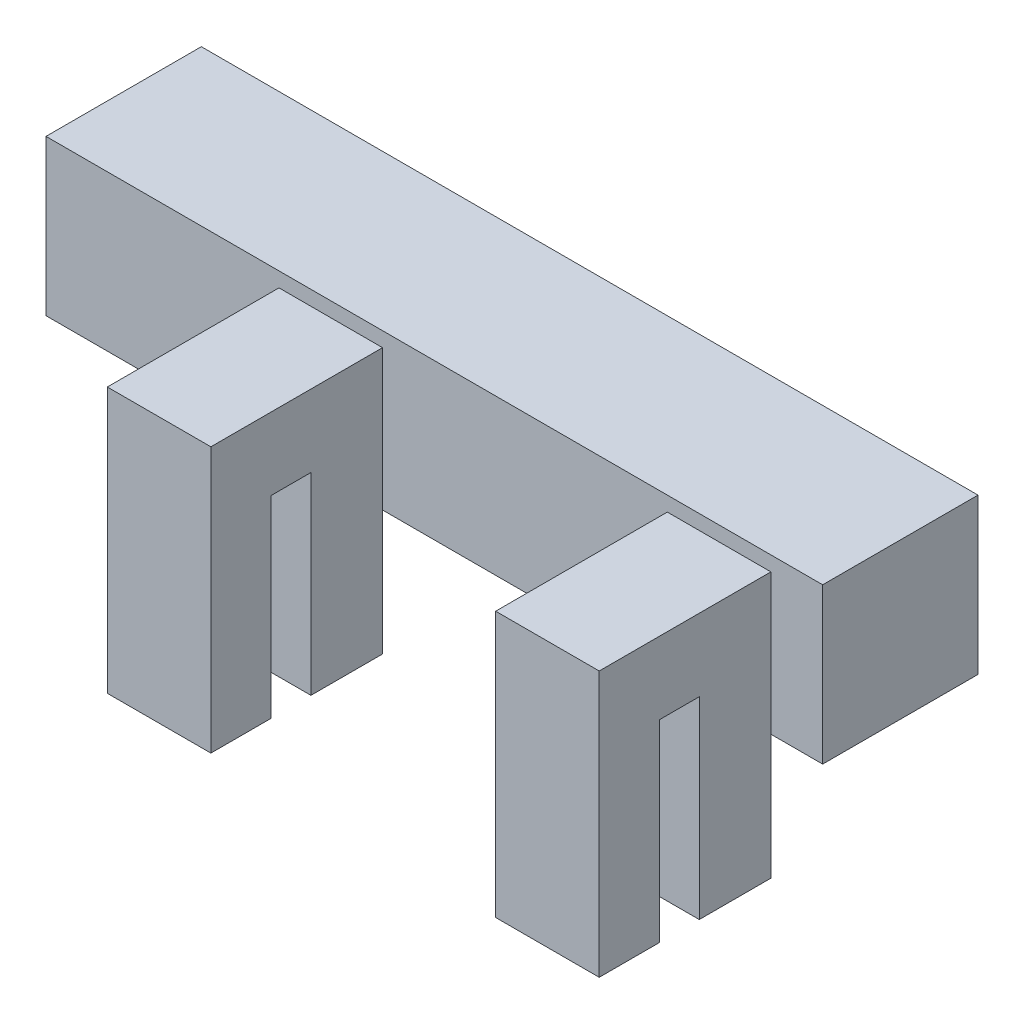
ISO-10303-21;
HEADER;
FILE_DESCRIPTION(('STEP AP214'),'2;1');
FILE_NAME('part.step','',(''),(''),'','','');
FILE_SCHEMA(('AUTOMOTIVE_DESIGN { 1 0 10303 214 1 1 1 1 }'));
ENDSEC;
DATA;
#1=APPLICATION_CONTEXT('core data for automotive mechanical design processes');
#2=APPLICATION_PROTOCOL_DEFINITION('international standard','automotive_design',2000,#1);
#3=PRODUCT_CONTEXT('',#1,'mechanical');
#4=PRODUCT('Part','Part','',(#3));
#5=PRODUCT_RELATED_PRODUCT_CATEGORY('part','',(#4));
#6=PRODUCT_DEFINITION_FORMATION('','',#4);
#7=PRODUCT_DEFINITION_CONTEXT('part definition',#1,'design');
#8=PRODUCT_DEFINITION('design','',#6,#7);
#9=PRODUCT_DEFINITION_SHAPE('','',#8);
#10=(LENGTH_UNIT() NAMED_UNIT(*) SI_UNIT(.MILLI.,.METRE.));
#11=(NAMED_UNIT(*) PLANE_ANGLE_UNIT() SI_UNIT($,.RADIAN.));
#12=(NAMED_UNIT(*) SI_UNIT($,.STERADIAN.) SOLID_ANGLE_UNIT());
#13=UNCERTAINTY_MEASURE_WITH_UNIT(LENGTH_MEASURE(1.E-05),#10,'distance_accuracy_value','');
#14=(GEOMETRIC_REPRESENTATION_CONTEXT(3) GLOBAL_UNCERTAINTY_ASSIGNED_CONTEXT((#13)) GLOBAL_UNIT_ASSIGNED_CONTEXT((#10,
#11,#12)) REPRESENTATION_CONTEXT('',''));
#15=CARTESIAN_POINT('',(0.,0.,0.));
#16=DIRECTION('',(0.,0.,1.));
#17=DIRECTION('',(1.,0.,0.));
#18=AXIS2_PLACEMENT_3D('',#15,#16,#17);
#19=CARTESIAN_POINT('',(0.,0.,30.));
#20=DIRECTION('',(0.,0.,1.));
#21=DIRECTION('',(1.,0.,0.));
#22=AXIS2_PLACEMENT_3D('',#19,#20,#21);
#23=PLANE('',#22);
#24=DIRECTION('',(-1.,0.,0.));
#25=VECTOR('',#24,1.);
#26=CARTESIAN_POINT('',(-10.,27.1581703390217,30.));
#27=LINE('',#26,#25);
#28=CARTESIAN_POINT('',(-10.,27.1581703390217,30.));
#29=VERTEX_POINT('',#28);
#30=CARTESIAN_POINT('',(-30.,27.1581703390217,30.));
#31=VERTEX_POINT('',#30);
#32=EDGE_CURVE('E48',#29,#31,#27,.T.);
#33=ORIENTED_EDGE('',*,*,#32,.F.);
#34=DIRECTION('',(0.,-1.,0.));
#35=VECTOR('',#34,1.);
#36=CARTESIAN_POINT('',(-10.,27.1581703390217,30.));
#37=LINE('',#36,#35);
#38=CARTESIAN_POINT('',(-10.,0.,30.));
#39=VERTEX_POINT('',#38);
#40=EDGE_CURVE('E191',#29,#39,#37,.T.);
#41=ORIENTED_EDGE('',*,*,#40,.T.);
#42=DIRECTION('',(1.,0.,0.));
#43=VECTOR('',#42,1.);
#44=CARTESIAN_POINT('',(0.,0.,30.));
#45=LINE('',#44,#43);
#46=CARTESIAN_POINT('',(0.,0.,30.));
#47=VERTEX_POINT('',#46);
#48=EDGE_CURVE('E333',#39,#47,#45,.T.);
#49=ORIENTED_EDGE('',*,*,#48,.T.);
#50=DIRECTION('',(0.,1.,0.));
#51=VECTOR('',#50,1.);
#52=CARTESIAN_POINT('',(0.,0.,30.));
#53=LINE('',#52,#51);
#54=CARTESIAN_POINT('',(0.,30.,30.));
#55=VERTEX_POINT('',#54);
#56=EDGE_CURVE('E325',#47,#55,#53,.T.);
#57=ORIENTED_EDGE('',*,*,#56,.T.);
#58=DIRECTION('',(-1.,0.,0.));
#59=VECTOR('',#58,1.);
#60=CARTESIAN_POINT('',(0.,30.,30.));
#61=LINE('',#60,#59);
#62=CARTESIAN_POINT('',(-150.,30.,30.));
#63=VERTEX_POINT('',#62);
#64=EDGE_CURVE('E328',#55,#63,#61,.T.);
#65=ORIENTED_EDGE('',*,*,#64,.T.);
#66=DIRECTION('',(0.,-1.,0.));
#67=VECTOR('',#66,1.);
#68=CARTESIAN_POINT('',(-150.,0.,30.));
#69=LINE('',#68,#67);
#70=CARTESIAN_POINT('',(-150.,0.,30.));
#71=VERTEX_POINT('',#70);
#72=EDGE_CURVE('E331',#63,#71,#69,.T.);
#73=ORIENTED_EDGE('',*,*,#72,.T.);
#74=CARTESIAN_POINT('',(-105.,0.,30.));
#75=VERTEX_POINT('',#74);
#76=EDGE_CURVE('E334',#71,#75,#45,.T.);
#77=ORIENTED_EDGE('',*,*,#76,.T.);
#78=DIRECTION('',(0.,-1.,0.));
#79=VECTOR('',#78,1.);
#80=CARTESIAN_POINT('',(-105.,27.1581703390217,30.));
#81=LINE('',#80,#79);
#82=CARTESIAN_POINT('',(-105.,27.1581703390217,30.));
#83=VERTEX_POINT('',#82);
#84=EDGE_CURVE('E284',#83,#75,#81,.T.);
#85=ORIENTED_EDGE('',*,*,#84,.F.);
#86=DIRECTION('',(-1.,0.,0.));
#87=VECTOR('',#86,1.);
#88=CARTESIAN_POINT('',(-85.,27.1581703390217,30.));
#89=LINE('',#88,#87);
#90=CARTESIAN_POINT('',(-85.,27.1581703390217,30.));
#91=VERTEX_POINT('',#90);
#92=EDGE_CURVE('E308',#91,#83,#89,.T.);
#93=ORIENTED_EDGE('',*,*,#92,.F.);
#94=DIRECTION('',(0.,-1.,0.));
#95=VECTOR('',#94,1.);
#96=CARTESIAN_POINT('',(-85.,27.1581703390217,30.));
#97=LINE('',#96,#95);
#98=CARTESIAN_POINT('',(-85.,0.,30.));
#99=VERTEX_POINT('',#98);
#100=EDGE_CURVE('E258',#91,#99,#97,.T.);
#101=ORIENTED_EDGE('',*,*,#100,.T.);
#102=CARTESIAN_POINT('',(-30.,0.,30.));
#103=VERTEX_POINT('',#102);
#104=EDGE_CURVE('E370',#99,#103,#45,.T.);
#105=ORIENTED_EDGE('',*,*,#104,.T.);
#106=DIRECTION('',(0.,-1.,0.));
#107=VECTOR('',#106,1.);
#108=CARTESIAN_POINT('',(-30.,27.1581703390217,30.));
#109=LINE('',#108,#107);
#110=EDGE_CURVE('E53',#31,#103,#109,.T.);
#111=ORIENTED_EDGE('',*,*,#110,.F.);
#112=EDGE_LOOP('',(#33,#41,#49,#57,#65,#73,#77,#85,#93,#101,#105,#111));
#113=FACE_BOUND('',#112,.T.);
#114=ADVANCED_FACE('F33',(#113),#23,.T.);
#115=CARTESIAN_POINT('',(0.,0.,30.));
#116=DIRECTION('',(-1.,0.,0.));
#117=DIRECTION('',(0.,-1.,0.));
#118=AXIS2_PLACEMENT_3D('',#115,#116,#117);
#119=PLANE('',#118);
#120=DIRECTION('',(0.,1.,0.));
#121=VECTOR('',#120,1.);
#122=CARTESIAN_POINT('',(0.,0.,0.));
#123=LINE('',#122,#121);
#124=CARTESIAN_POINT('',(0.,0.,0.));
#125=VERTEX_POINT('',#124);
#126=CARTESIAN_POINT('',(0.,30.,0.));
#127=VERTEX_POINT('',#126);
#128=EDGE_CURVE('E310',#125,#127,#123,.T.);
#129=ORIENTED_EDGE('',*,*,#128,.T.);
#130=DIRECTION('',(0.,0.,-1.));
#131=VECTOR('',#130,1.);
#132=CARTESIAN_POINT('',(0.,30.,30.));
#133=LINE('',#132,#131);
#134=EDGE_CURVE('E11',#55,#127,#133,.T.);
#135=ORIENTED_EDGE('',*,*,#134,.F.);
#136=ORIENTED_EDGE('',*,*,#56,.F.);
#137=DIRECTION('',(0.,0.,-1.));
#138=VECTOR('',#137,1.);
#139=CARTESIAN_POINT('',(0.,0.,30.));
#140=LINE('',#139,#138);
#141=EDGE_CURVE('E337',#47,#125,#140,.T.);
#142=ORIENTED_EDGE('',*,*,#141,.T.);
#143=EDGE_LOOP('',(#129,#135,#136,#142));
#144=FACE_BOUND('',#143,.T.);
#145=ADVANCED_FACE('F35',(#144),#119,.F.);
#146=CARTESIAN_POINT('',(0.,30.,30.));
#147=DIRECTION('',(0.,-1.,0.));
#148=DIRECTION('',(1.,0.,0.));
#149=AXIS2_PLACEMENT_3D('',#146,#147,#148);
#150=PLANE('',#149);
#151=DIRECTION('',(-1.,0.,0.));
#152=VECTOR('',#151,1.);
#153=CARTESIAN_POINT('',(0.,30.,0.));
#154=LINE('',#153,#152);
#155=CARTESIAN_POINT('',(-150.,30.,0.));
#156=VERTEX_POINT('',#155);
#157=EDGE_CURVE('E341',#127,#156,#154,.T.);
#158=ORIENTED_EDGE('',*,*,#157,.T.);
#159=DIRECTION('',(0.,0.,-1.));
#160=VECTOR('',#159,1.);
#161=CARTESIAN_POINT('',(-150.,30.,30.));
#162=LINE('',#161,#160);
#163=EDGE_CURVE('E41',#63,#156,#162,.T.);
#164=ORIENTED_EDGE('',*,*,#163,.F.);
#165=ORIENTED_EDGE('',*,*,#64,.F.);
#166=ORIENTED_EDGE('',*,*,#134,.T.);
#167=EDGE_LOOP('',(#158,#164,#165,#166));
#168=FACE_BOUND('',#167,.T.);
#169=ADVANCED_FACE('F417',(#168),#150,.F.);
#170=CARTESIAN_POINT('',(-150.,0.,30.));
#171=DIRECTION('',(1.,0.,0.));
#172=DIRECTION('',(0.,0.,-1.));
#173=AXIS2_PLACEMENT_3D('',#170,#171,#172);
#174=PLANE('',#173);
#175=DIRECTION('',(0.,-1.,0.));
#176=VECTOR('',#175,1.);
#177=CARTESIAN_POINT('',(-150.,0.,0.));
#178=LINE('',#177,#176);
#179=CARTESIAN_POINT('',(-150.,0.,0.));
#180=VERTEX_POINT('',#179);
#181=EDGE_CURVE('E343',#156,#180,#178,.T.);
#182=ORIENTED_EDGE('',*,*,#181,.T.);
#183=DIRECTION('',(0.,0.,-1.));
#184=VECTOR('',#183,1.);
#185=CARTESIAN_POINT('',(-150.,0.,30.));
#186=LINE('',#185,#184);
#187=EDGE_CURVE('E348',#71,#180,#186,.T.);
#188=ORIENTED_EDGE('',*,*,#187,.F.);
#189=ORIENTED_EDGE('',*,*,#72,.F.);
#190=ORIENTED_EDGE('',*,*,#163,.T.);
#191=EDGE_LOOP('',(#182,#188,#189,#190));
#192=FACE_BOUND('',#191,.T.);
#193=ADVANCED_FACE('F355',(#192),#174,.F.);
#194=CARTESIAN_POINT('',(0.,0.,30.));
#195=DIRECTION('',(0.,1.,0.));
#196=DIRECTION('',(-1.,0.,0.));
#197=AXIS2_PLACEMENT_3D('',#194,#195,#196);
#198=PLANE('',#197);
#199=DIRECTION('',(1.,0.,0.));
#200=VECTOR('',#199,1.);
#201=CARTESIAN_POINT('',(0.,0.,0.));
#202=LINE('',#201,#200);
#203=EDGE_CURVE('E329',#180,#125,#202,.T.);
#204=ORIENTED_EDGE('',*,*,#203,.T.);
#205=ORIENTED_EDGE('',*,*,#141,.F.);
#206=ORIENTED_EDGE('',*,*,#48,.F.);
#207=EDGE_CURVE('E188',#103,#39,#45,.T.);
#208=ORIENTED_EDGE('',*,*,#207,.F.);
#209=ORIENTED_EDGE('',*,*,#104,.F.);
#210=EDGE_CURVE('E338',#75,#99,#45,.T.);
#211=ORIENTED_EDGE('',*,*,#210,.F.);
#212=ORIENTED_EDGE('',*,*,#76,.F.);
#213=ORIENTED_EDGE('',*,*,#187,.T.);
#214=EDGE_LOOP('',(#204,#205,#206,#208,#209,#211,#212,#213));
#215=FACE_BOUND('',#214,.T.);
#216=ADVANCED_FACE('F364',(#215),#198,.F.);
#217=CARTESIAN_POINT('',(0.,0.,0.));
#218=DIRECTION('',(0.,0.,1.));
#219=DIRECTION('',(1.,0.,0.));
#220=AXIS2_PLACEMENT_3D('',#217,#218,#219);
#221=PLANE('',#220);
#222=ORIENTED_EDGE('',*,*,#128,.F.);
#223=ORIENTED_EDGE('',*,*,#203,.F.);
#224=ORIENTED_EDGE('',*,*,#181,.F.);
#225=ORIENTED_EDGE('',*,*,#157,.F.);
#226=EDGE_LOOP('',(#222,#223,#224,#225));
#227=FACE_BOUND('',#226,.T.);
#228=ADVANCED_FACE('F361',(#227),#221,.F.);
#229=CARTESIAN_POINT('',(-85.,27.1581703390217,30.));
#230=DIRECTION('',(0.,0.,-1.));
#231=DIRECTION('',(-1.,0.,0.));
#232=AXIS2_PLACEMENT_3D('',#229,#230,#231);
#233=PLANE('',#232);
#234=CARTESIAN_POINT('',(-105.,-24.0798332325672,30.));
#235=VERTEX_POINT('',#234);
#236=EDGE_CURVE('E246',#75,#235,#81,.T.);
#237=ORIENTED_EDGE('',*,*,#236,.F.);
#238=ORIENTED_EDGE('',*,*,#210,.T.);
#239=CARTESIAN_POINT('',(-85.,-24.0798332325672,30.));
#240=VERTEX_POINT('',#239);
#241=EDGE_CURVE('E262',#99,#240,#97,.T.);
#242=ORIENTED_EDGE('',*,*,#241,.T.);
#243=DIRECTION('',(-1.,0.,0.));
#244=VECTOR('',#243,1.);
#245=CARTESIAN_POINT('',(-85.,-24.0798332325672,30.));
#246=LINE('',#245,#244);
#247=EDGE_CURVE('E283',#240,#235,#246,.T.);
#248=ORIENTED_EDGE('',*,*,#247,.T.);
#249=EDGE_LOOP('',(#237,#238,#242,#248));
#250=FACE_BOUND('',#249,.T.);
#251=ADVANCED_FACE('F375',(#250),#233,.T.);
#252=CARTESIAN_POINT('',(-85.,27.1581703390217,30.));
#253=DIRECTION('',(0.,1.,0.));
#254=DIRECTION('',(0.,0.,1.));
#255=AXIS2_PLACEMENT_3D('',#252,#253,#254);
#256=PLANE('',#255);
#257=DIRECTION('',(0.,0.,-1.));
#258=VECTOR('',#257,1.);
#259=CARTESIAN_POINT('',(-105.,27.1581703390217,30.));
#260=LINE('',#259,#258);
#261=CARTESIAN_POINT('',(-105.,27.1581703390217,63.1561933360463));
#262=VERTEX_POINT('',#261);
#263=EDGE_CURVE('E305',#262,#83,#260,.T.);
#264=ORIENTED_EDGE('',*,*,#263,.F.);
#265=DIRECTION('',(-1.,0.,0.));
#266=VECTOR('',#265,1.);
#267=CARTESIAN_POINT('',(-85.,27.1581703390217,63.1561933360463));
#268=LINE('',#267,#266);
#269=CARTESIAN_POINT('',(-85.,27.1581703390217,63.1561933360463));
#270=VERTEX_POINT('',#269);
#271=EDGE_CURVE('E311',#270,#262,#268,.T.);
#272=ORIENTED_EDGE('',*,*,#271,.F.);
#273=DIRECTION('',(0.,0.,-1.));
#274=VECTOR('',#273,1.);
#275=CARTESIAN_POINT('',(-85.,27.1581703390217,30.));
#276=LINE('',#275,#274);
#277=EDGE_CURVE('E280',#270,#91,#276,.T.);
#278=ORIENTED_EDGE('',*,*,#277,.T.);
#279=ORIENTED_EDGE('',*,*,#92,.T.);
#280=EDGE_LOOP('',(#264,#272,#278,#279));
#281=FACE_BOUND('',#280,.T.);
#282=ADVANCED_FACE('F450',(#281),#256,.T.);
#283=CARTESIAN_POINT('',(-85.,27.1581703390217,63.1561933360463));
#284=DIRECTION('',(0.,0.,1.));
#285=DIRECTION('',(1.,0.,0.));
#286=AXIS2_PLACEMENT_3D('',#283,#284,#285);
#287=PLANE('',#286);
#288=DIRECTION('',(0.,1.,0.));
#289=VECTOR('',#288,1.);
#290=CARTESIAN_POINT('',(-105.,27.1581703390217,63.1561933360463));
#291=LINE('',#290,#289);
#292=CARTESIAN_POINT('',(-105.,-24.0798332325672,63.1561933360463));
#293=VERTEX_POINT('',#292);
#294=EDGE_CURVE('E302',#293,#262,#291,.T.);
#295=ORIENTED_EDGE('',*,*,#294,.F.);
#296=DIRECTION('',(-1.,0.,0.));
#297=VECTOR('',#296,1.);
#298=CARTESIAN_POINT('',(-85.,-24.0798332325672,63.1561933360463));
#299=LINE('',#298,#297);
#300=CARTESIAN_POINT('',(-85.,-24.0798332325672,63.1561933360463));
#301=VERTEX_POINT('',#300);
#302=EDGE_CURVE('E313',#301,#293,#299,.T.);
#303=ORIENTED_EDGE('',*,*,#302,.F.);
#304=DIRECTION('',(0.,1.,0.));
#305=VECTOR('',#304,1.);
#306=CARTESIAN_POINT('',(-85.,27.1581703390217,63.1561933360463));
#307=LINE('',#306,#305);
#308=EDGE_CURVE('E277',#301,#270,#307,.T.);
#309=ORIENTED_EDGE('',*,*,#308,.T.);
#310=ORIENTED_EDGE('',*,*,#271,.T.);
#311=EDGE_LOOP('',(#295,#303,#309,#310));
#312=FACE_BOUND('',#311,.T.);
#313=ADVANCED_FACE('F456',(#312),#287,.T.);
#314=CARTESIAN_POINT('',(-85.,-24.0798332325672,51.5046134278178));
#315=DIRECTION('',(0.,-1.,0.));
#316=DIRECTION('',(0.,0.,-1.));
#317=AXIS2_PLACEMENT_3D('',#314,#315,#316);
#318=PLANE('',#317);
#319=DIRECTION('',(0.,0.,1.));
#320=VECTOR('',#319,1.);
#321=CARTESIAN_POINT('',(-105.,-24.0798332325672,51.5046134278178));
#322=LINE('',#321,#320);
#323=CARTESIAN_POINT('',(-105.,-24.0798332325672,51.5046134278178));
#324=VERTEX_POINT('',#323);
#325=EDGE_CURVE('E299',#324,#293,#322,.T.);
#326=ORIENTED_EDGE('',*,*,#325,.F.);
#327=DIRECTION('',(-1.,0.,0.));
#328=VECTOR('',#327,1.);
#329=CARTESIAN_POINT('',(-85.,-24.0798332325672,51.5046134278178));
#330=LINE('',#329,#328);
#331=CARTESIAN_POINT('',(-85.,-24.0798332325672,51.5046134278178));
#332=VERTEX_POINT('',#331);
#333=EDGE_CURVE('E315',#332,#324,#330,.T.);
#334=ORIENTED_EDGE('',*,*,#333,.F.);
#335=DIRECTION('',(0.,0.,1.));
#336=VECTOR('',#335,1.);
#337=CARTESIAN_POINT('',(-85.,-24.0798332325672,51.5046134278178));
#338=LINE('',#337,#336);
#339=EDGE_CURVE('E274',#332,#301,#338,.T.);
#340=ORIENTED_EDGE('',*,*,#339,.T.);
#341=ORIENTED_EDGE('',*,*,#302,.T.);
#342=EDGE_LOOP('',(#326,#334,#340,#341));
#343=FACE_BOUND('',#342,.T.);
#344=ADVANCED_FACE('F464',(#343),#318,.T.);
#345=CARTESIAN_POINT('',(-85.,-24.0798332325672,51.5046134278178));
#346=DIRECTION('',(0.,0.,-1.));
#347=DIRECTION('',(-1.,0.,0.));
#348=AXIS2_PLACEMENT_3D('',#345,#346,#347);
#349=PLANE('',#348);
#350=DIRECTION('',(0.,-1.,0.));
#351=VECTOR('',#350,1.);
#352=CARTESIAN_POINT('',(-105.,-24.0798332325672,51.5046134278178));
#353=LINE('',#352,#351);
#354=CARTESIAN_POINT('',(-105.,13.1907484614558,51.5046134278178));
#355=VERTEX_POINT('',#354);
#356=EDGE_CURVE('E296',#355,#324,#353,.T.);
#357=ORIENTED_EDGE('',*,*,#356,.F.);
#358=DIRECTION('',(-1.,0.,0.));
#359=VECTOR('',#358,1.);
#360=CARTESIAN_POINT('',(-85.,13.1907484614558,51.5046134278178));
#361=LINE('',#360,#359);
#362=CARTESIAN_POINT('',(-85.,13.1907484614558,51.5046134278178));
#363=VERTEX_POINT('',#362);
#364=EDGE_CURVE('E317',#363,#355,#361,.T.);
#365=ORIENTED_EDGE('',*,*,#364,.F.);
#366=DIRECTION('',(0.,-1.,0.));
#367=VECTOR('',#366,1.);
#368=CARTESIAN_POINT('',(-85.,-24.0798332325672,51.5046134278178));
#369=LINE('',#368,#367);
#370=EDGE_CURVE('E271',#363,#332,#369,.T.);
#371=ORIENTED_EDGE('',*,*,#370,.T.);
#372=ORIENTED_EDGE('',*,*,#333,.T.);
#373=EDGE_LOOP('',(#357,#365,#371,#372));
#374=FACE_BOUND('',#373,.T.);
#375=ADVANCED_FACE('F472',(#374),#349,.T.);
#376=CARTESIAN_POINT('',(-85.,13.1907484614558,43.8333869043878));
#377=DIRECTION('',(0.,-1.,0.));
#378=DIRECTION('',(0.,0.,-1.));
#379=AXIS2_PLACEMENT_3D('',#376,#377,#378);
#380=PLANE('',#379);
#381=DIRECTION('',(0.,0.,1.));
#382=VECTOR('',#381,1.);
#383=CARTESIAN_POINT('',(-105.,13.1907484614558,43.8333869043878));
#384=LINE('',#383,#382);
#385=CARTESIAN_POINT('',(-105.,13.1907484614558,43.8333869043878));
#386=VERTEX_POINT('',#385);
#387=EDGE_CURVE('E293',#386,#355,#384,.T.);
#388=ORIENTED_EDGE('',*,*,#387,.F.);
#389=DIRECTION('',(-1.,0.,0.));
#390=VECTOR('',#389,1.);
#391=CARTESIAN_POINT('',(-85.,13.1907484614558,43.8333869043878));
#392=LINE('',#391,#390);
#393=CARTESIAN_POINT('',(-85.,13.1907484614558,43.8333869043878));
#394=VERTEX_POINT('',#393);
#395=EDGE_CURVE('E319',#394,#386,#392,.T.);
#396=ORIENTED_EDGE('',*,*,#395,.F.);
#397=DIRECTION('',(0.,0.,1.));
#398=VECTOR('',#397,1.);
#399=CARTESIAN_POINT('',(-85.,13.1907484614558,43.8333869043878));
#400=LINE('',#399,#398);
#401=EDGE_CURVE('E268',#394,#363,#400,.T.);
#402=ORIENTED_EDGE('',*,*,#401,.T.);
#403=ORIENTED_EDGE('',*,*,#364,.T.);
#404=EDGE_LOOP('',(#388,#396,#402,#403));
#405=FACE_BOUND('',#404,.T.);
#406=ADVANCED_FACE('F480',(#405),#380,.T.);
#407=CARTESIAN_POINT('',(-85.,-24.0798332325672,43.8333869043878));
#408=DIRECTION('',(0.,0.,1.));
#409=DIRECTION('',(1.,0.,0.));
#410=AXIS2_PLACEMENT_3D('',#407,#408,#409);
#411=PLANE('',#410);
#412=DIRECTION('',(0.,1.,0.));
#413=VECTOR('',#412,1.);
#414=CARTESIAN_POINT('',(-105.,-24.0798332325672,43.8333869043878));
#415=LINE('',#414,#413);
#416=CARTESIAN_POINT('',(-105.,-24.0798332325672,43.8333869043878));
#417=VERTEX_POINT('',#416);
#418=EDGE_CURVE('E290',#417,#386,#415,.T.);
#419=ORIENTED_EDGE('',*,*,#418,.F.);
#420=DIRECTION('',(-1.,0.,0.));
#421=VECTOR('',#420,1.);
#422=CARTESIAN_POINT('',(-85.,-24.0798332325672,43.8333869043878));
#423=LINE('',#422,#421);
#424=CARTESIAN_POINT('',(-85.,-24.0798332325672,43.8333869043878));
#425=VERTEX_POINT('',#424);
#426=EDGE_CURVE('E321',#425,#417,#423,.T.);
#427=ORIENTED_EDGE('',*,*,#426,.F.);
#428=DIRECTION('',(0.,1.,0.));
#429=VECTOR('',#428,1.);
#430=CARTESIAN_POINT('',(-85.,-24.0798332325672,43.8333869043878));
#431=LINE('',#430,#429);
#432=EDGE_CURVE('E265',#425,#394,#431,.T.);
#433=ORIENTED_EDGE('',*,*,#432,.T.);
#434=ORIENTED_EDGE('',*,*,#395,.T.);
#435=EDGE_LOOP('',(#419,#427,#433,#434));
#436=FACE_BOUND('',#435,.T.);
#437=ADVANCED_FACE('F488',(#436),#411,.T.);
#438=CARTESIAN_POINT('',(-85.,-24.0798332325672,30.));
#439=DIRECTION('',(0.,-1.,0.));
#440=DIRECTION('',(0.,0.,-1.));
#441=AXIS2_PLACEMENT_3D('',#438,#439,#440);
#442=PLANE('',#441);
#443=DIRECTION('',(0.,0.,1.));
#444=VECTOR('',#443,1.);
#445=CARTESIAN_POINT('',(-105.,-24.0798332325672,30.));
#446=LINE('',#445,#444);
#447=EDGE_CURVE('E287',#235,#417,#446,.T.);
#448=ORIENTED_EDGE('',*,*,#447,.F.);
#449=ORIENTED_EDGE('',*,*,#247,.F.);
#450=DIRECTION('',(0.,0.,1.));
#451=VECTOR('',#450,1.);
#452=CARTESIAN_POINT('',(-85.,-24.0798332325672,30.));
#453=LINE('',#452,#451);
#454=EDGE_CURVE('E261',#240,#425,#453,.T.);
#455=ORIENTED_EDGE('',*,*,#454,.T.);
#456=ORIENTED_EDGE('',*,*,#426,.T.);
#457=EDGE_LOOP('',(#448,#449,#455,#456));
#458=FACE_BOUND('',#457,.T.);
#459=ADVANCED_FACE('F496',(#458),#442,.T.);
#460=CARTESIAN_POINT('',(-85.,0.,0.));
#461=DIRECTION('',(-1.,0.,0.));
#462=DIRECTION('',(0.,0.,1.));
#463=AXIS2_PLACEMENT_3D('',#460,#461,#462);
#464=PLANE('',#463);
#465=ORIENTED_EDGE('',*,*,#100,.F.);
#466=ORIENTED_EDGE('',*,*,#277,.F.);
#467=ORIENTED_EDGE('',*,*,#308,.F.);
#468=ORIENTED_EDGE('',*,*,#339,.F.);
#469=ORIENTED_EDGE('',*,*,#370,.F.);
#470=ORIENTED_EDGE('',*,*,#401,.F.);
#471=ORIENTED_EDGE('',*,*,#432,.F.);
#472=ORIENTED_EDGE('',*,*,#454,.F.);
#473=ORIENTED_EDGE('',*,*,#241,.F.);
#474=EDGE_LOOP('',(#465,#466,#467,#468,#469,#470,#471,#472,#473));
#475=FACE_BOUND('',#474,.T.);
#476=ADVANCED_FACE('F504',(#475),#464,.F.);
#477=CARTESIAN_POINT('',(-105.,0.,0.));
#478=DIRECTION('',(-1.,0.,0.));
#479=DIRECTION('',(0.,0.,1.));
#480=AXIS2_PLACEMENT_3D('',#477,#478,#479);
#481=PLANE('',#480);
#482=ORIENTED_EDGE('',*,*,#84,.T.);
#483=ORIENTED_EDGE('',*,*,#236,.T.);
#484=ORIENTED_EDGE('',*,*,#447,.T.);
#485=ORIENTED_EDGE('',*,*,#418,.T.);
#486=ORIENTED_EDGE('',*,*,#387,.T.);
#487=ORIENTED_EDGE('',*,*,#356,.T.);
#488=ORIENTED_EDGE('',*,*,#325,.T.);
#489=ORIENTED_EDGE('',*,*,#294,.T.);
#490=ORIENTED_EDGE('',*,*,#263,.T.);
#491=EDGE_LOOP('',(#482,#483,#484,#485,#486,#487,#488,#489,#490));
#492=FACE_BOUND('',#491,.T.);
#493=ADVANCED_FACE('F511',(#492),#481,.T.);
#494=CARTESIAN_POINT('',(-10.,27.1581703390217,30.));
#495=DIRECTION('',(0.,0.,-1.));
#496=DIRECTION('',(-1.,0.,0.));
#497=AXIS2_PLACEMENT_3D('',#494,#495,#496);
#498=PLANE('',#497);
#499=ORIENTED_EDGE('',*,*,#207,.T.);
#500=CARTESIAN_POINT('',(-10.,-24.0798332325672,30.));
#501=VERTEX_POINT('',#500);
#502=EDGE_CURVE('E181',#39,#501,#37,.T.);
#503=ORIENTED_EDGE('',*,*,#502,.T.);
#504=DIRECTION('',(-1.,0.,0.));
#505=VECTOR('',#504,1.);
#506=CARTESIAN_POINT('',(-10.,-24.0798332325672,30.));
#507=LINE('',#506,#505);
#508=CARTESIAN_POINT('',(-30.,-24.0798332325672,30.));
#509=VERTEX_POINT('',#508);
#510=EDGE_CURVE('E185',#501,#509,#507,.T.);
#511=ORIENTED_EDGE('',*,*,#510,.T.);
#512=EDGE_CURVE('E226',#103,#509,#109,.T.);
#513=ORIENTED_EDGE('',*,*,#512,.F.);
#514=EDGE_LOOP('',(#499,#503,#511,#513));
#515=FACE_BOUND('',#514,.T.);
#516=ADVANCED_FACE('F183',(#515),#498,.T.);
#517=CARTESIAN_POINT('',(-10.,27.1581703390217,30.));
#518=DIRECTION('',(0.,1.,0.));
#519=DIRECTION('',(0.,0.,1.));
#520=AXIS2_PLACEMENT_3D('',#517,#518,#519);
#521=PLANE('',#520);
#522=DIRECTION('',(0.,0.,-1.));
#523=VECTOR('',#522,1.);
#524=CARTESIAN_POINT('',(-30.,27.1581703390217,30.));
#525=LINE('',#524,#523);
#526=CARTESIAN_POINT('',(-30.,27.1581703390217,63.1561933360463));
#527=VERTEX_POINT('',#526);
#528=EDGE_CURVE('E192',#527,#31,#525,.T.);
#529=ORIENTED_EDGE('',*,*,#528,.F.);
#530=DIRECTION('',(-1.,0.,0.));
#531=VECTOR('',#530,1.);
#532=CARTESIAN_POINT('',(-10.,27.1581703390217,63.1561933360463));
#533=LINE('',#532,#531);
#534=CARTESIAN_POINT('',(-10.,27.1581703390217,63.1561933360463));
#535=VERTEX_POINT('',#534);
#536=EDGE_CURVE('E247',#535,#527,#533,.T.);
#537=ORIENTED_EDGE('',*,*,#536,.F.);
#538=DIRECTION('',(0.,0.,-1.));
#539=VECTOR('',#538,1.);
#540=CARTESIAN_POINT('',(-10.,27.1581703390217,30.));
#541=LINE('',#540,#539);
#542=EDGE_CURVE('E201',#535,#29,#541,.T.);
#543=ORIENTED_EDGE('',*,*,#542,.T.);
#544=ORIENTED_EDGE('',*,*,#32,.T.);
#545=EDGE_LOOP('',(#529,#537,#543,#544));
#546=FACE_BOUND('',#545,.T.);
#547=ADVANCED_FACE('F386',(#546),#521,.T.);
#548=CARTESIAN_POINT('',(-10.,27.1581703390217,63.1561933360463));
#549=DIRECTION('',(0.,0.,1.));
#550=DIRECTION('',(1.,0.,0.));
#551=AXIS2_PLACEMENT_3D('',#548,#549,#550);
#552=PLANE('',#551);
#553=DIRECTION('',(0.,1.,0.));
#554=VECTOR('',#553,1.);
#555=CARTESIAN_POINT('',(-30.,27.1581703390217,63.1561933360463));
#556=LINE('',#555,#554);
#557=CARTESIAN_POINT('',(-30.,-24.0798332325672,63.1561933360463));
#558=VERTEX_POINT('',#557);
#559=EDGE_CURVE('E240',#558,#527,#556,.T.);
#560=ORIENTED_EDGE('',*,*,#559,.F.);
#561=DIRECTION('',(-1.,0.,0.));
#562=VECTOR('',#561,1.);
#563=CARTESIAN_POINT('',(-10.,-24.0798332325672,63.1561933360463));
#564=LINE('',#563,#562);
#565=CARTESIAN_POINT('',(-10.,-24.0798332325672,63.1561933360463));
#566=VERTEX_POINT('',#565);
#567=EDGE_CURVE('E249',#566,#558,#564,.T.);
#568=ORIENTED_EDGE('',*,*,#567,.F.);
#569=DIRECTION('',(0.,1.,0.));
#570=VECTOR('',#569,1.);
#571=CARTESIAN_POINT('',(-10.,27.1581703390217,63.1561933360463));
#572=LINE('',#571,#570);
#573=EDGE_CURVE('E220',#566,#535,#572,.T.);
#574=ORIENTED_EDGE('',*,*,#573,.T.);
#575=ORIENTED_EDGE('',*,*,#536,.T.);
#576=EDGE_LOOP('',(#560,#568,#574,#575));
#577=FACE_BOUND('',#576,.T.);
#578=ADVANCED_FACE('F530',(#577),#552,.T.);
#579=CARTESIAN_POINT('',(-10.,-24.0798332325672,51.5046134278178));
#580=DIRECTION('',(0.,-1.,0.));
#581=DIRECTION('',(0.,0.,-1.));
#582=AXIS2_PLACEMENT_3D('',#579,#580,#581);
#583=PLANE('',#582);
#584=DIRECTION('',(0.,0.,1.));
#585=VECTOR('',#584,1.);
#586=CARTESIAN_POINT('',(-30.,-24.0798332325672,51.5046134278178));
#587=LINE('',#586,#585);
#588=CARTESIAN_POINT('',(-30.,-24.0798332325672,51.5046134278178));
#589=VERTEX_POINT('',#588);
#590=EDGE_CURVE('E237',#589,#558,#587,.T.);
#591=ORIENTED_EDGE('',*,*,#590,.F.);
#592=DIRECTION('',(-1.,0.,0.));
#593=VECTOR('',#592,1.);
#594=CARTESIAN_POINT('',(-10.,-24.0798332325672,51.5046134278178));
#595=LINE('',#594,#593);
#596=CARTESIAN_POINT('',(-10.,-24.0798332325672,51.5046134278178));
#597=VERTEX_POINT('',#596);
#598=EDGE_CURVE('E251',#597,#589,#595,.T.);
#599=ORIENTED_EDGE('',*,*,#598,.F.);
#600=DIRECTION('',(0.,0.,1.));
#601=VECTOR('',#600,1.);
#602=CARTESIAN_POINT('',(-10.,-24.0798332325672,51.5046134278178));
#603=LINE('',#602,#601);
#604=EDGE_CURVE('E217',#597,#566,#603,.T.);
#605=ORIENTED_EDGE('',*,*,#604,.T.);
#606=ORIENTED_EDGE('',*,*,#567,.T.);
#607=EDGE_LOOP('',(#591,#599,#605,#606));
#608=FACE_BOUND('',#607,.T.);
#609=ADVANCED_FACE('F394',(#608),#583,.T.);
#610=CARTESIAN_POINT('',(-10.,-24.0798332325672,51.5046134278178));
#611=DIRECTION('',(0.,0.,-1.));
#612=DIRECTION('',(-1.,0.,0.));
#613=AXIS2_PLACEMENT_3D('',#610,#611,#612);
#614=PLANE('',#613);
#615=DIRECTION('',(0.,-1.,0.));
#616=VECTOR('',#615,1.);
#617=CARTESIAN_POINT('',(-30.,-24.0798332325672,51.5046134278178));
#618=LINE('',#617,#616);
#619=CARTESIAN_POINT('',(-30.,13.1907484614558,51.5046134278178));
#620=VERTEX_POINT('',#619);
#621=EDGE_CURVE('E234',#620,#589,#618,.T.);
#622=ORIENTED_EDGE('',*,*,#621,.F.);
#623=DIRECTION('',(-1.,0.,0.));
#624=VECTOR('',#623,1.);
#625=CARTESIAN_POINT('',(-10.,13.1907484614558,51.5046134278178));
#626=LINE('',#625,#624);
#627=CARTESIAN_POINT('',(-10.,13.1907484614558,51.5046134278178));
#628=VERTEX_POINT('',#627);
#629=EDGE_CURVE('E253',#628,#620,#626,.T.);
#630=ORIENTED_EDGE('',*,*,#629,.F.);
#631=DIRECTION('',(0.,-1.,0.));
#632=VECTOR('',#631,1.);
#633=CARTESIAN_POINT('',(-10.,-24.0798332325672,51.5046134278178));
#634=LINE('',#633,#632);
#635=EDGE_CURVE('E214',#628,#597,#634,.T.);
#636=ORIENTED_EDGE('',*,*,#635,.T.);
#637=ORIENTED_EDGE('',*,*,#598,.T.);
#638=EDGE_LOOP('',(#622,#630,#636,#637));
#639=FACE_BOUND('',#638,.T.);
#640=ADVANCED_FACE('F397',(#639),#614,.T.);
#641=CARTESIAN_POINT('',(-10.,13.1907484614558,43.8333869043878));
#642=DIRECTION('',(0.,-1.,0.));
#643=DIRECTION('',(0.,0.,-1.));
#644=AXIS2_PLACEMENT_3D('',#641,#642,#643);
#645=PLANE('',#644);
#646=DIRECTION('',(0.,0.,1.));
#647=VECTOR('',#646,1.);
#648=CARTESIAN_POINT('',(-30.,13.1907484614558,43.8333869043878));
#649=LINE('',#648,#647);
#650=CARTESIAN_POINT('',(-30.,13.1907484614558,43.8333869043878));
#651=VERTEX_POINT('',#650);
#652=EDGE_CURVE('E231',#651,#620,#649,.T.);
#653=ORIENTED_EDGE('',*,*,#652,.F.);
#654=DIRECTION('',(-1.,0.,0.));
#655=VECTOR('',#654,1.);
#656=CARTESIAN_POINT('',(-10.,13.1907484614558,43.8333869043878));
#657=LINE('',#656,#655);
#658=CARTESIAN_POINT('',(-10.,13.1907484614558,43.8333869043878));
#659=VERTEX_POINT('',#658);
#660=EDGE_CURVE('E255',#659,#651,#657,.T.);
#661=ORIENTED_EDGE('',*,*,#660,.F.);
#662=DIRECTION('',(0.,0.,1.));
#663=VECTOR('',#662,1.);
#664=CARTESIAN_POINT('',(-10.,13.1907484614558,43.8333869043878));
#665=LINE('',#664,#663);
#666=EDGE_CURVE('E209',#659,#628,#665,.T.);
#667=ORIENTED_EDGE('',*,*,#666,.T.);
#668=ORIENTED_EDGE('',*,*,#629,.T.);
#669=EDGE_LOOP('',(#653,#661,#667,#668));
#670=FACE_BOUND('',#669,.T.);
#671=ADVANCED_FACE('F400',(#670),#645,.T.);
#672=CARTESIAN_POINT('',(-10.,-24.0798332325672,43.8333869043878));
#673=DIRECTION('',(0.,0.,1.));
#674=DIRECTION('',(1.,0.,0.));
#675=AXIS2_PLACEMENT_3D('',#672,#673,#674);
#676=PLANE('',#675);
#677=DIRECTION('',(0.,1.,0.));
#678=VECTOR('',#677,1.);
#679=CARTESIAN_POINT('',(-30.,-24.0798332325672,43.8333869043878));
#680=LINE('',#679,#678);
#681=CARTESIAN_POINT('',(-30.,-24.0798332325672,43.8333869043878));
#682=VERTEX_POINT('',#681);
#683=EDGE_CURVE('E228',#682,#651,#680,.T.);
#684=ORIENTED_EDGE('',*,*,#683,.F.);
#685=DIRECTION('',(-1.,0.,0.));
#686=VECTOR('',#685,1.);
#687=CARTESIAN_POINT('',(-10.,-24.0798332325672,43.8333869043878));
#688=LINE('',#687,#686);
#689=CARTESIAN_POINT('',(-10.,-24.0798332325672,43.8333869043878));
#690=VERTEX_POINT('',#689);
#691=EDGE_CURVE('E200',#690,#682,#688,.T.);
#692=ORIENTED_EDGE('',*,*,#691,.F.);
#693=DIRECTION('',(0.,1.,0.));
#694=VECTOR('',#693,1.);
#695=CARTESIAN_POINT('',(-10.,-24.0798332325672,43.8333869043878));
#696=LINE('',#695,#694);
#697=EDGE_CURVE('E207',#690,#659,#696,.T.);
#698=ORIENTED_EDGE('',*,*,#697,.T.);
#699=ORIENTED_EDGE('',*,*,#660,.T.);
#700=EDGE_LOOP('',(#684,#692,#698,#699));
#701=FACE_BOUND('',#700,.T.);
#702=ADVANCED_FACE('F403',(#701),#676,.T.);
#703=CARTESIAN_POINT('',(-10.,-24.0798332325672,30.));
#704=DIRECTION('',(0.,-1.,0.));
#705=DIRECTION('',(0.,0.,-1.));
#706=AXIS2_PLACEMENT_3D('',#703,#704,#705);
#707=PLANE('',#706);
#708=DIRECTION('',(0.,0.,1.));
#709=VECTOR('',#708,1.);
#710=CARTESIAN_POINT('',(-30.,-24.0798332325672,30.));
#711=LINE('',#710,#709);
#712=EDGE_CURVE('E199',#509,#682,#711,.T.);
#713=ORIENTED_EDGE('',*,*,#712,.F.);
#714=ORIENTED_EDGE('',*,*,#510,.F.);
#715=DIRECTION('',(0.,0.,1.));
#716=VECTOR('',#715,1.);
#717=CARTESIAN_POINT('',(-10.,-24.0798332325672,30.));
#718=LINE('',#717,#716);
#719=EDGE_CURVE('E197',#501,#690,#718,.T.);
#720=ORIENTED_EDGE('',*,*,#719,.T.);
#721=ORIENTED_EDGE('',*,*,#691,.T.);
#722=EDGE_LOOP('',(#713,#714,#720,#721));
#723=FACE_BOUND('',#722,.T.);
#724=ADVANCED_FACE('F196',(#723),#707,.T.);
#725=CARTESIAN_POINT('',(-10.,0.,0.));
#726=DIRECTION('',(-1.,0.,0.));
#727=DIRECTION('',(0.,0.,1.));
#728=AXIS2_PLACEMENT_3D('',#725,#726,#727);
#729=PLANE('',#728);
#730=ORIENTED_EDGE('',*,*,#40,.F.);
#731=ORIENTED_EDGE('',*,*,#542,.F.);
#732=ORIENTED_EDGE('',*,*,#573,.F.);
#733=ORIENTED_EDGE('',*,*,#604,.F.);
#734=ORIENTED_EDGE('',*,*,#635,.F.);
#735=ORIENTED_EDGE('',*,*,#666,.F.);
#736=ORIENTED_EDGE('',*,*,#697,.F.);
#737=ORIENTED_EDGE('',*,*,#719,.F.);
#738=ORIENTED_EDGE('',*,*,#502,.F.);
#739=EDGE_LOOP('',(#730,#731,#732,#733,#734,#735,#736,#737,#738));
#740=FACE_BOUND('',#739,.T.);
#741=ADVANCED_FACE('F204',(#740),#729,.F.);
#742=CARTESIAN_POINT('',(-30.,0.,0.));
#743=DIRECTION('',(-1.,0.,0.));
#744=DIRECTION('',(0.,0.,1.));
#745=AXIS2_PLACEMENT_3D('',#742,#743,#744);
#746=PLANE('',#745);
#747=ORIENTED_EDGE('',*,*,#110,.T.);
#748=ORIENTED_EDGE('',*,*,#512,.T.);
#749=ORIENTED_EDGE('',*,*,#712,.T.);
#750=ORIENTED_EDGE('',*,*,#683,.T.);
#751=ORIENTED_EDGE('',*,*,#652,.T.);
#752=ORIENTED_EDGE('',*,*,#621,.T.);
#753=ORIENTED_EDGE('',*,*,#590,.T.);
#754=ORIENTED_EDGE('',*,*,#559,.T.);
#755=ORIENTED_EDGE('',*,*,#528,.T.);
#756=EDGE_LOOP('',(#747,#748,#749,#750,#751,#752,#753,#754,#755));
#757=FACE_BOUND('',#756,.T.);
#758=ADVANCED_FACE('F382',(#757),#746,.T.);
#759=CLOSED_SHELL('',(#114,#145,#169,#193,#216,#228,#251,#282,#313,#344,#375,#406,#437,#459,
#476,#493,#516,#547,#578,#609,#640,#671,#702,#724,#741,#758));
#760=MANIFOLD_SOLID_BREP('B2',#759);
#761=ADVANCED_BREP_SHAPE_REPRESENTATION('',(#18,#760),#14);
#762=SHAPE_DEFINITION_REPRESENTATION(#9,#761);
ENDSEC;
END-ISO-10303-21;
